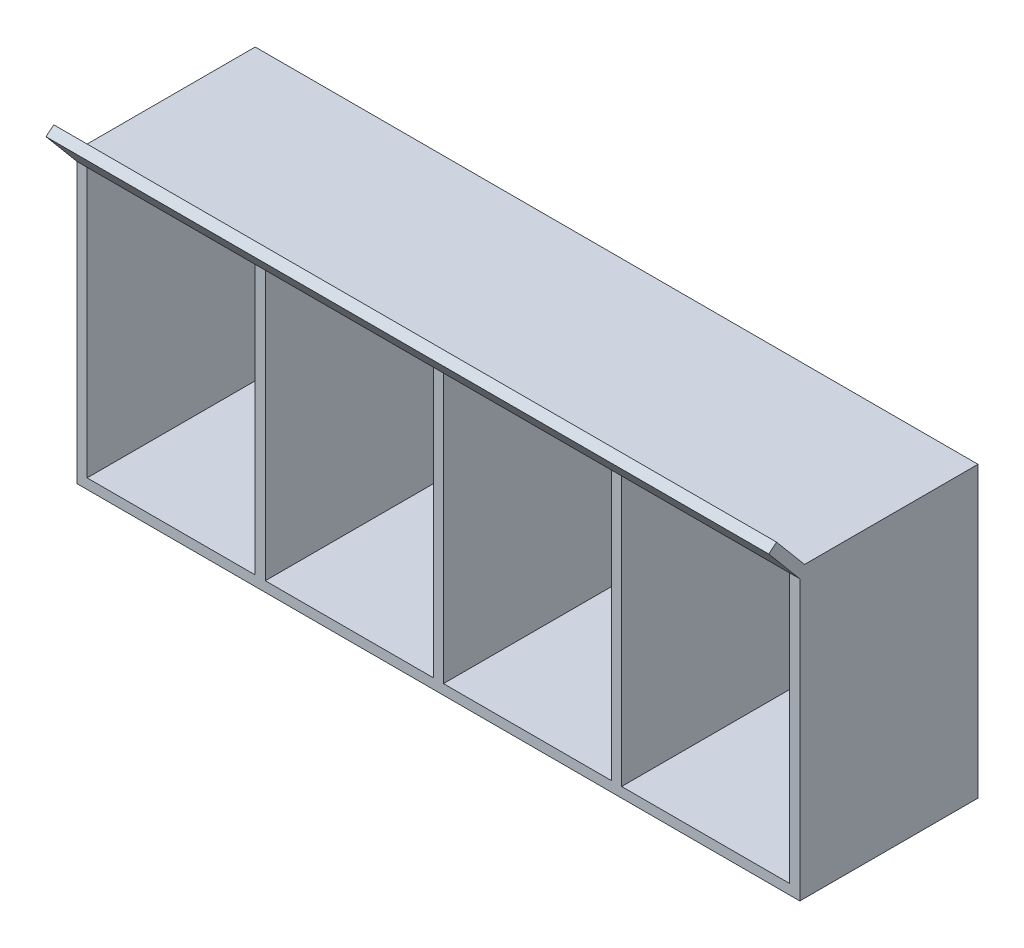
ISO-10303-21;
HEADER;
FILE_DESCRIPTION(('STEP AP214'),'2;1');
FILE_NAME('part.step','',(''),(''),'','','');
FILE_SCHEMA(('AUTOMOTIVE_DESIGN { 1 0 10303 214 1 1 1 1 }'));
ENDSEC;
DATA;
#1=APPLICATION_CONTEXT('core data for automotive mechanical design processes');
#2=APPLICATION_PROTOCOL_DEFINITION('international standard','automotive_design',2000,#1);
#3=PRODUCT_CONTEXT('',#1,'mechanical');
#4=PRODUCT('Part','Part','',(#3));
#5=PRODUCT_RELATED_PRODUCT_CATEGORY('part','',(#4));
#6=PRODUCT_DEFINITION_FORMATION('','',#4);
#7=PRODUCT_DEFINITION_CONTEXT('part definition',#1,'design');
#8=PRODUCT_DEFINITION('design','',#6,#7);
#9=PRODUCT_DEFINITION_SHAPE('','',#8);
#10=(LENGTH_UNIT() NAMED_UNIT(*) SI_UNIT(.MILLI.,.METRE.));
#11=(NAMED_UNIT(*) PLANE_ANGLE_UNIT() SI_UNIT($,.RADIAN.));
#12=(NAMED_UNIT(*) SI_UNIT($,.STERADIAN.) SOLID_ANGLE_UNIT());
#13=UNCERTAINTY_MEASURE_WITH_UNIT(LENGTH_MEASURE(1.E-05),#10,'distance_accuracy_value','');
#14=(GEOMETRIC_REPRESENTATION_CONTEXT(3) GLOBAL_UNCERTAINTY_ASSIGNED_CONTEXT((#13)) GLOBAL_UNIT_ASSIGNED_CONTEXT((#10,
#11,#12)) REPRESENTATION_CONTEXT('',''));
#15=CARTESIAN_POINT('',(0.,0.,0.));
#16=DIRECTION('',(0.,0.,1.));
#17=DIRECTION('',(1.,0.,0.));
#18=AXIS2_PLACEMENT_3D('',#15,#16,#17);
#19=CARTESIAN_POINT('',(3.,0.,50.));
#20=DIRECTION('',(1.,0.,0.));
#21=DIRECTION('',(0.,0.,-1.));
#22=AXIS2_PLACEMENT_3D('',#19,#20,#21);
#23=PLANE('',#22);
#24=DIRECTION('',(0.,-1.,0.));
#25=VECTOR('',#24,1.);
#26=CARTESIAN_POINT('',(3.,0.,0.));
#27=LINE('',#26,#25);
#28=CARTESIAN_POINT('',(3.,83.,0.));
#29=VERTEX_POINT('',#28);
#30=CARTESIAN_POINT('',(3.,3.,0.));
#31=VERTEX_POINT('',#30);
#32=EDGE_CURVE('E231',#29,#31,#27,.T.);
#33=ORIENTED_EDGE('',*,*,#32,.F.);
#34=DIRECTION('',(0.,0.,-1.));
#35=VECTOR('',#34,1.);
#36=CARTESIAN_POINT('',(3.,83.,50.));
#37=LINE('',#36,#35);
#38=CARTESIAN_POINT('',(3.,83.,50.));
#39=VERTEX_POINT('',#38);
#40=EDGE_CURVE('E247',#39,#29,#37,.T.);
#41=ORIENTED_EDGE('',*,*,#40,.F.);
#42=DIRECTION('',(0.,-1.,0.));
#43=VECTOR('',#42,1.);
#44=CARTESIAN_POINT('',(3.,0.,50.));
#45=LINE('',#44,#43);
#46=CARTESIAN_POINT('',(3.,3.,50.));
#47=VERTEX_POINT('',#46);
#48=EDGE_CURVE('E162',#39,#47,#45,.T.);
#49=ORIENTED_EDGE('',*,*,#48,.T.);
#50=DIRECTION('',(0.,0.,-1.));
#51=VECTOR('',#50,1.);
#52=CARTESIAN_POINT('',(3.,3.,50.));
#53=LINE('',#52,#51);
#54=EDGE_CURVE('E74',#47,#31,#53,.T.);
#55=ORIENTED_EDGE('',*,*,#54,.T.);
#56=EDGE_LOOP('',(#33,#41,#49,#55));
#57=FACE_BOUND('',#56,.T.);
#58=ADVANCED_FACE('F49',(#57),#23,.T.);
#59=CARTESIAN_POINT('',(0.,83.,50.));
#60=DIRECTION('',(0.,1.,0.));
#61=DIRECTION('',(0.,0.,1.));
#62=AXIS2_PLACEMENT_3D('',#59,#60,#61);
#63=PLANE('',#62);
#64=DIRECTION('',(1.,0.,0.));
#65=VECTOR('',#64,1.);
#66=CARTESIAN_POINT('',(0.,83.,0.));
#67=LINE('',#66,#65);
#68=CARTESIAN_POINT('',(53.,83.,0.));
#69=VERTEX_POINT('',#68);
#70=EDGE_CURVE('E234',#29,#69,#67,.T.);
#71=ORIENTED_EDGE('',*,*,#70,.T.);
#72=DIRECTION('',(0.,0.,-1.));
#73=VECTOR('',#72,1.);
#74=CARTESIAN_POINT('',(53.,83.,50.));
#75=LINE('',#74,#73);
#76=CARTESIAN_POINT('',(53.,83.,50.));
#77=VERTEX_POINT('',#76);
#78=EDGE_CURVE('E245',#77,#69,#75,.T.);
#79=ORIENTED_EDGE('',*,*,#78,.F.);
#80=DIRECTION('',(1.,0.,0.));
#81=VECTOR('',#80,1.);
#82=CARTESIAN_POINT('',(0.,83.,50.));
#83=LINE('',#82,#81);
#84=EDGE_CURVE('E190',#39,#77,#83,.T.);
#85=ORIENTED_EDGE('',*,*,#84,.F.);
#86=ORIENTED_EDGE('',*,*,#40,.T.);
#87=EDGE_LOOP('',(#71,#79,#85,#86));
#88=FACE_BOUND('',#87,.T.);
#89=ADVANCED_FACE('F464',(#88),#63,.F.);
#90=CARTESIAN_POINT('',(53.,0.,50.));
#91=DIRECTION('',(1.,0.,0.));
#92=DIRECTION('',(0.,0.,-1.));
#93=AXIS2_PLACEMENT_3D('',#90,#91,#92);
#94=PLANE('',#93);
#95=DIRECTION('',(0.,-1.,0.));
#96=VECTOR('',#95,1.);
#97=CARTESIAN_POINT('',(53.,0.,0.));
#98=LINE('',#97,#96);
#99=CARTESIAN_POINT('',(53.,3.,0.));
#100=VERTEX_POINT('',#99);
#101=EDGE_CURVE('E115',#69,#100,#98,.T.);
#102=ORIENTED_EDGE('',*,*,#101,.T.);
#103=DIRECTION('',(0.,0.,-1.));
#104=VECTOR('',#103,1.);
#105=CARTESIAN_POINT('',(53.,3.,50.));
#106=LINE('',#105,#104);
#107=CARTESIAN_POINT('',(53.,3.,50.));
#108=VERTEX_POINT('',#107);
#109=EDGE_CURVE('E242',#108,#100,#106,.T.);
#110=ORIENTED_EDGE('',*,*,#109,.F.);
#111=DIRECTION('',(0.,-1.,0.));
#112=VECTOR('',#111,1.);
#113=CARTESIAN_POINT('',(53.,0.,50.));
#114=LINE('',#113,#112);
#115=EDGE_CURVE('E193',#77,#108,#114,.T.);
#116=ORIENTED_EDGE('',*,*,#115,.F.);
#117=ORIENTED_EDGE('',*,*,#78,.T.);
#118=EDGE_LOOP('',(#102,#110,#116,#117));
#119=FACE_BOUND('',#118,.T.);
#120=ADVANCED_FACE('F471',(#119),#94,.F.);
#121=CARTESIAN_POINT('',(0.,3.,50.));
#122=DIRECTION('',(0.,1.,0.));
#123=DIRECTION('',(0.,0.,1.));
#124=AXIS2_PLACEMENT_3D('',#121,#122,#123);
#125=PLANE('',#124);
#126=DIRECTION('',(1.,0.,0.));
#127=VECTOR('',#126,1.);
#128=CARTESIAN_POINT('',(0.,3.,0.));
#129=LINE('',#128,#127);
#130=CARTESIAN_POINT('',(56.,3.,0.));
#131=VERTEX_POINT('',#130);
#132=CARTESIAN_POINT('',(106.,3.,0.));
#133=VERTEX_POINT('',#132);
#134=EDGE_CURVE('E222',#131,#133,#129,.T.);
#135=ORIENTED_EDGE('',*,*,#134,.F.);
#136=DIRECTION('',(0.,0.,-1.));
#137=VECTOR('',#136,1.);
#138=CARTESIAN_POINT('',(56.,3.,50.));
#139=LINE('',#138,#137);
#140=CARTESIAN_POINT('',(56.,3.,50.));
#141=VERTEX_POINT('',#140);
#142=EDGE_CURVE('E178',#141,#131,#139,.T.);
#143=ORIENTED_EDGE('',*,*,#142,.F.);
#144=DIRECTION('',(1.,0.,0.));
#145=VECTOR('',#144,1.);
#146=CARTESIAN_POINT('',(0.,3.,50.));
#147=LINE('',#146,#145);
#148=CARTESIAN_POINT('',(106.,3.,50.));
#149=VERTEX_POINT('',#148);
#150=EDGE_CURVE('E155',#141,#149,#147,.T.);
#151=ORIENTED_EDGE('',*,*,#150,.T.);
#152=DIRECTION('',(0.,0.,-1.));
#153=VECTOR('',#152,1.);
#154=CARTESIAN_POINT('',(106.,3.,50.));
#155=LINE('',#154,#153);
#156=EDGE_CURVE('E166',#149,#133,#155,.T.);
#157=ORIENTED_EDGE('',*,*,#156,.T.);
#158=EDGE_LOOP('',(#135,#143,#151,#157));
#159=FACE_BOUND('',#158,.T.);
#160=ADVANCED_FACE('F176',(#159),#125,.T.);
#161=CARTESIAN_POINT('',(56.,0.,50.));
#162=DIRECTION('',(1.,0.,0.));
#163=DIRECTION('',(0.,0.,-1.));
#164=AXIS2_PLACEMENT_3D('',#161,#162,#163);
#165=PLANE('',#164);
#166=DIRECTION('',(0.,-1.,0.));
#167=VECTOR('',#166,1.);
#168=CARTESIAN_POINT('',(56.,0.,0.));
#169=LINE('',#168,#167);
#170=CARTESIAN_POINT('',(56.,83.,0.));
#171=VERTEX_POINT('',#170);
#172=EDGE_CURVE('E224',#171,#131,#169,.T.);
#173=ORIENTED_EDGE('',*,*,#172,.F.);
#174=DIRECTION('',(0.,0.,-1.));
#175=VECTOR('',#174,1.);
#176=CARTESIAN_POINT('',(56.,83.,50.));
#177=LINE('',#176,#175);
#178=CARTESIAN_POINT('',(56.,83.,50.));
#179=VERTEX_POINT('',#178);
#180=EDGE_CURVE('E251',#179,#171,#177,.T.);
#181=ORIENTED_EDGE('',*,*,#180,.F.);
#182=DIRECTION('',(0.,-1.,0.));
#183=VECTOR('',#182,1.);
#184=CARTESIAN_POINT('',(56.,0.,50.));
#185=LINE('',#184,#183);
#186=EDGE_CURVE('E179',#179,#141,#185,.T.);
#187=ORIENTED_EDGE('',*,*,#186,.T.);
#188=ORIENTED_EDGE('',*,*,#142,.T.);
#189=EDGE_LOOP('',(#173,#181,#187,#188));
#190=FACE_BOUND('',#189,.T.);
#191=ADVANCED_FACE('F375',(#190),#165,.T.);
#192=CARTESIAN_POINT('',(0.,83.,50.));
#193=DIRECTION('',(0.,1.,0.));
#194=DIRECTION('',(0.,0.,1.));
#195=AXIS2_PLACEMENT_3D('',#192,#193,#194);
#196=PLANE('',#195);
#197=DIRECTION('',(1.,0.,0.));
#198=VECTOR('',#197,1.);
#199=CARTESIAN_POINT('',(0.,83.,0.));
#200=LINE('',#199,#198);
#201=CARTESIAN_POINT('',(106.,83.,0.));
#202=VERTEX_POINT('',#201);
#203=EDGE_CURVE('E227',#171,#202,#200,.T.);
#204=ORIENTED_EDGE('',*,*,#203,.T.);
#205=DIRECTION('',(0.,0.,-1.));
#206=VECTOR('',#205,1.);
#207=CARTESIAN_POINT('',(106.,83.,50.));
#208=LINE('',#207,#206);
#209=CARTESIAN_POINT('',(106.,83.,50.));
#210=VERTEX_POINT('',#209);
#211=EDGE_CURVE('E173',#210,#202,#208,.T.);
#212=ORIENTED_EDGE('',*,*,#211,.F.);
#213=DIRECTION('',(1.,0.,0.));
#214=VECTOR('',#213,1.);
#215=CARTESIAN_POINT('',(0.,83.,50.));
#216=LINE('',#215,#214);
#217=EDGE_CURVE('E163',#179,#210,#216,.T.);
#218=ORIENTED_EDGE('',*,*,#217,.F.);
#219=ORIENTED_EDGE('',*,*,#180,.T.);
#220=EDGE_LOOP('',(#204,#212,#218,#219));
#221=FACE_BOUND('',#220,.T.);
#222=ADVANCED_FACE('F380',(#221),#196,.F.);
#223=CARTESIAN_POINT('',(0.,3.,50.));
#224=DIRECTION('',(0.,1.,0.));
#225=DIRECTION('',(-1.,0.,0.));
#226=AXIS2_PLACEMENT_3D('',#223,#224,#225);
#227=PLANE('',#226);
#228=DIRECTION('',(1.,0.,0.));
#229=VECTOR('',#228,1.);
#230=CARTESIAN_POINT('',(0.,3.,0.));
#231=LINE('',#230,#229);
#232=CARTESIAN_POINT('',(109.,3.,0.));
#233=VERTEX_POINT('',#232);
#234=CARTESIAN_POINT('',(159.,2.99999999999999,0.));
#235=VERTEX_POINT('',#234);
#236=EDGE_CURVE('E210',#233,#235,#231,.T.);
#237=ORIENTED_EDGE('',*,*,#236,.F.);
#238=DIRECTION('',(0.,0.,-1.));
#239=VECTOR('',#238,1.);
#240=CARTESIAN_POINT('',(109.,3.,50.));
#241=LINE('',#240,#239);
#242=CARTESIAN_POINT('',(109.,3.,50.));
#243=VERTEX_POINT('',#242);
#244=EDGE_CURVE('E174',#243,#233,#241,.T.);
#245=ORIENTED_EDGE('',*,*,#244,.F.);
#246=DIRECTION('',(1.,0.,0.));
#247=VECTOR('',#246,1.);
#248=CARTESIAN_POINT('',(0.,3.,50.));
#249=LINE('',#248,#247);
#250=CARTESIAN_POINT('',(159.,2.99999999999999,50.));
#251=VERTEX_POINT('',#250);
#252=EDGE_CURVE('E318',#243,#251,#249,.T.);
#253=ORIENTED_EDGE('',*,*,#252,.T.);
#254=DIRECTION('',(0.,0.,-1.));
#255=VECTOR('',#254,1.);
#256=CARTESIAN_POINT('',(159.,2.99999999999999,50.));
#257=LINE('',#256,#255);
#258=EDGE_CURVE('E254',#251,#235,#257,.T.);
#259=ORIENTED_EDGE('',*,*,#258,.T.);
#260=EDGE_LOOP('',(#237,#245,#253,#259));
#261=FACE_BOUND('',#260,.T.);
#262=ADVANCED_FACE('F349',(#261),#227,.T.);
#263=CARTESIAN_POINT('',(109.,0.,50.));
#264=DIRECTION('',(1.,0.,0.));
#265=DIRECTION('',(0.,0.,-1.));
#266=AXIS2_PLACEMENT_3D('',#263,#264,#265);
#267=PLANE('',#266);
#268=DIRECTION('',(0.,-1.,0.));
#269=VECTOR('',#268,1.);
#270=CARTESIAN_POINT('',(109.,0.,0.));
#271=LINE('',#270,#269);
#272=CARTESIAN_POINT('',(109.,83.,0.));
#273=VERTEX_POINT('',#272);
#274=EDGE_CURVE('E213',#273,#233,#271,.T.);
#275=ORIENTED_EDGE('',*,*,#274,.F.);
#276=DIRECTION('',(0.,0.,-1.));
#277=VECTOR('',#276,1.);
#278=CARTESIAN_POINT('',(109.,83.,50.));
#279=LINE('',#278,#277);
#280=CARTESIAN_POINT('',(109.,83.,50.));
#281=VERTEX_POINT('',#280);
#282=EDGE_CURVE('E259',#281,#273,#279,.T.);
#283=ORIENTED_EDGE('',*,*,#282,.F.);
#284=DIRECTION('',(0.,-1.,0.));
#285=VECTOR('',#284,1.);
#286=CARTESIAN_POINT('',(109.,0.,50.));
#287=LINE('',#286,#285);
#288=EDGE_CURVE('E321',#281,#243,#287,.T.);
#289=ORIENTED_EDGE('',*,*,#288,.T.);
#290=ORIENTED_EDGE('',*,*,#244,.T.);
#291=EDGE_LOOP('',(#275,#283,#289,#290));
#292=FACE_BOUND('',#291,.T.);
#293=ADVANCED_FACE('F352',(#292),#267,.T.);
#294=CARTESIAN_POINT('',(0.,83.,50.));
#295=DIRECTION('',(0.,1.,0.));
#296=DIRECTION('',(0.,0.,1.));
#297=AXIS2_PLACEMENT_3D('',#294,#295,#296);
#298=PLANE('',#297);
#299=DIRECTION('',(1.,0.,0.));
#300=VECTOR('',#299,1.);
#301=CARTESIAN_POINT('',(0.,83.,0.));
#302=LINE('',#301,#300);
#303=CARTESIAN_POINT('',(159.,83.,0.));
#304=VERTEX_POINT('',#303);
#305=EDGE_CURVE('E216',#273,#304,#302,.T.);
#306=ORIENTED_EDGE('',*,*,#305,.T.);
#307=DIRECTION('',(0.,0.,-1.));
#308=VECTOR('',#307,1.);
#309=CARTESIAN_POINT('',(159.,83.,50.));
#310=LINE('',#309,#308);
#311=CARTESIAN_POINT('',(159.,83.,50.));
#312=VERTEX_POINT('',#311);
#313=EDGE_CURVE('E256',#312,#304,#310,.T.);
#314=ORIENTED_EDGE('',*,*,#313,.F.);
#315=DIRECTION('',(1.,0.,0.));
#316=VECTOR('',#315,1.);
#317=CARTESIAN_POINT('',(0.,83.,50.));
#318=LINE('',#317,#316);
#319=EDGE_CURVE('E183',#281,#312,#318,.T.);
#320=ORIENTED_EDGE('',*,*,#319,.F.);
#321=ORIENTED_EDGE('',*,*,#282,.T.);
#322=EDGE_LOOP('',(#306,#314,#320,#321));
#323=FACE_BOUND('',#322,.T.);
#324=ADVANCED_FACE('F341',(#323),#298,.F.);
#325=CARTESIAN_POINT('',(215.,0.,50.));
#326=DIRECTION('',(1.,0.,0.));
#327=DIRECTION('',(0.,0.,-1.));
#328=AXIS2_PLACEMENT_3D('',#325,#326,#327);
#329=PLANE('',#328);
#330=DIRECTION('',(0.,0.,-1.));
#331=VECTOR('',#330,1.);
#332=CARTESIAN_POINT('',(215.,86.,50.));
#333=LINE('',#332,#331);
#334=CARTESIAN_POINT('',(215.,86.,48.601077025535));
#335=VERTEX_POINT('',#334);
#336=CARTESIAN_POINT('',(215.,86.,-3.));
#337=VERTEX_POINT('',#336);
#338=EDGE_CURVE('E257',#335,#337,#333,.T.);
#339=ORIENTED_EDGE('',*,*,#338,.F.);
#340=DIRECTION('',(0.,0.766044443118979,0.642787609686538));
#341=VECTOR('',#340,1.);
#342=CARTESIAN_POINT('',(215.,95.9283628290596,56.9319626135931));
#343=LINE('',#342,#341);
#344=CARTESIAN_POINT('',(215.,95.9283628290596,56.9319626135931));
#345=VERTEX_POINT('',#344);
#346=EDGE_CURVE('E417',#335,#345,#343,.T.);
#347=ORIENTED_EDGE('',*,*,#346,.T.);
#348=DIRECTION('',(0.,-0.642787609686539,0.766044443118979));
#349=VECTOR('',#348,1.);
#350=CARTESIAN_POINT('',(215.,94.,59.2300959429501));
#351=LINE('',#350,#349);
#352=CARTESIAN_POINT('',(215.,94.,59.2300959429501));
#353=VERTEX_POINT('',#352);
#354=EDGE_CURVE('E909',#345,#353,#351,.T.);
#355=ORIENTED_EDGE('',*,*,#354,.T.);
#356=DIRECTION('',(0.,-0.766044443118979,-0.642787609686539));
#357=VECTOR('',#356,1.);
#358=CARTESIAN_POINT('',(215.,83.,50.));
#359=LINE('',#358,#357);
#360=CARTESIAN_POINT('',(215.,83.,50.));
#361=VERTEX_POINT('',#360);
#362=EDGE_CURVE('E65',#353,#361,#359,.T.);
#363=ORIENTED_EDGE('',*,*,#362,.T.);
#364=DIRECTION('',(0.,-1.,0.));
#365=VECTOR('',#364,1.);
#366=CARTESIAN_POINT('',(215.,0.,50.));
#367=LINE('',#366,#365);
#368=CARTESIAN_POINT('',(215.,0.,50.));
#369=VERTEX_POINT('',#368);
#370=EDGE_CURVE('E306',#361,#369,#367,.T.);
#371=ORIENTED_EDGE('',*,*,#370,.T.);
#372=DIRECTION('',(0.,0.,-1.));
#373=VECTOR('',#372,1.);
#374=CARTESIAN_POINT('',(215.,0.,50.));
#375=LINE('',#374,#373);
#376=CARTESIAN_POINT('',(215.,0.,-3.));
#377=VERTEX_POINT('',#376);
#378=EDGE_CURVE('E263',#369,#377,#375,.T.);
#379=ORIENTED_EDGE('',*,*,#378,.T.);
#380=DIRECTION('',(0.,-1.,0.));
#381=VECTOR('',#380,1.);
#382=CARTESIAN_POINT('',(215.,86.,-3.));
#383=LINE('',#382,#381);
#384=EDGE_CURVE('E440',#337,#377,#383,.T.);
#385=ORIENTED_EDGE('',*,*,#384,.F.);
#386=EDGE_LOOP('',(#339,#347,#355,#363,#371,#379,#385));
#387=FACE_BOUND('',#386,.T.);
#388=ADVANCED_FACE('F490',(#387),#329,.T.);
#389=CARTESIAN_POINT('',(0.,86.,50.));
#390=DIRECTION('',(0.,1.,0.));
#391=DIRECTION('',(-1.,0.,0.));
#392=AXIS2_PLACEMENT_3D('',#389,#390,#391);
#393=PLANE('',#392);
#394=DIRECTION('',(1.,0.,0.));
#395=VECTOR('',#394,1.);
#396=CARTESIAN_POINT('',(0.,86.,48.601077025535));
#397=LINE('',#396,#395);
#398=CARTESIAN_POINT('',(0.,86.,48.601077025535));
#399=VERTEX_POINT('',#398);
#400=EDGE_CURVE('E412',#399,#335,#397,.T.);
#401=ORIENTED_EDGE('',*,*,#400,.T.);
#402=ORIENTED_EDGE('',*,*,#338,.T.);
#403=DIRECTION('',(1.,0.,0.));
#404=VECTOR('',#403,1.);
#405=CARTESIAN_POINT('',(0.,86.,-3.));
#406=LINE('',#405,#404);
#407=CARTESIAN_POINT('',(0.,86.,-3.));
#408=VERTEX_POINT('',#407);
#409=EDGE_CURVE('E435',#408,#337,#406,.T.);
#410=ORIENTED_EDGE('',*,*,#409,.F.);
#411=DIRECTION('',(0.,0.,-1.));
#412=VECTOR('',#411,1.);
#413=CARTESIAN_POINT('',(0.,86.,50.));
#414=LINE('',#413,#412);
#415=EDGE_CURVE('E269',#399,#408,#414,.T.);
#416=ORIENTED_EDGE('',*,*,#415,.F.);
#417=EDGE_LOOP('',(#401,#402,#410,#416));
#418=FACE_BOUND('',#417,.T.);
#419=ADVANCED_FACE('F433',(#418),#393,.T.);
#420=CARTESIAN_POINT('',(0.,0.,50.));
#421=DIRECTION('',(1.,0.,0.));
#422=DIRECTION('',(0.,0.,-1.));
#423=AXIS2_PLACEMENT_3D('',#420,#421,#422);
#424=PLANE('',#423);
#425=DIRECTION('',(0.,0.766044443118979,0.642787609686538));
#426=VECTOR('',#425,1.);
#427=CARTESIAN_POINT('',(0.,95.9283628290596,56.9319626135931));
#428=LINE('',#427,#426);
#429=CARTESIAN_POINT('',(0.,95.9283628290596,56.9319626135931));
#430=VERTEX_POINT('',#429);
#431=EDGE_CURVE('E415',#399,#430,#428,.T.);
#432=ORIENTED_EDGE('',*,*,#431,.F.);
#433=ORIENTED_EDGE('',*,*,#415,.T.);
#434=DIRECTION('',(0.,1.,0.));
#435=VECTOR('',#434,1.);
#436=CARTESIAN_POINT('',(0.,86.,-3.));
#437=LINE('',#436,#435);
#438=CARTESIAN_POINT('',(0.,0.,-3.));
#439=VERTEX_POINT('',#438);
#440=EDGE_CURVE('E441',#439,#408,#437,.T.);
#441=ORIENTED_EDGE('',*,*,#440,.F.);
#442=DIRECTION('',(0.,0.,-1.));
#443=VECTOR('',#442,1.);
#444=CARTESIAN_POINT('',(0.,0.,50.));
#445=LINE('',#444,#443);
#446=CARTESIAN_POINT('',(0.,0.,50.));
#447=VERTEX_POINT('',#446);
#448=EDGE_CURVE('E266',#447,#439,#445,.T.);
#449=ORIENTED_EDGE('',*,*,#448,.F.);
#450=DIRECTION('',(0.,-1.,0.));
#451=VECTOR('',#450,1.);
#452=CARTESIAN_POINT('',(0.,0.,50.));
#453=LINE('',#452,#451);
#454=CARTESIAN_POINT('',(0.,83.,50.));
#455=VERTEX_POINT('',#454);
#456=EDGE_CURVE('E309',#455,#447,#453,.T.);
#457=ORIENTED_EDGE('',*,*,#456,.F.);
#458=DIRECTION('',(0.,-0.766044443118979,-0.642787609686539));
#459=VECTOR('',#458,1.);
#460=CARTESIAN_POINT('',(0.,83.,50.));
#461=LINE('',#460,#459);
#462=CARTESIAN_POINT('',(0.,94.,59.2300959429501));
#463=VERTEX_POINT('',#462);
#464=EDGE_CURVE('E422',#463,#455,#461,.T.);
#465=ORIENTED_EDGE('',*,*,#464,.F.);
#466=DIRECTION('',(0.,-0.642787609686539,0.766044443118979));
#467=VECTOR('',#466,1.);
#468=CARTESIAN_POINT('',(0.,94.,59.2300959429501));
#469=LINE('',#468,#467);
#470=EDGE_CURVE('E431',#430,#463,#469,.T.);
#471=ORIENTED_EDGE('',*,*,#470,.F.);
#472=EDGE_LOOP('',(#432,#433,#441,#449,#457,#465,#471));
#473=FACE_BOUND('',#472,.T.);
#474=ADVANCED_FACE('F426',(#473),#424,.F.);
#475=CARTESIAN_POINT('',(0.,3.,50.));
#476=DIRECTION('',(0.,1.,0.));
#477=DIRECTION('',(-1.,0.,0.));
#478=AXIS2_PLACEMENT_3D('',#475,#476,#477);
#479=PLANE('',#478);
#480=DIRECTION('',(1.,0.,0.));
#481=VECTOR('',#480,1.);
#482=CARTESIAN_POINT('',(0.,3.,0.));
#483=LINE('',#482,#481);
#484=CARTESIAN_POINT('',(162.,2.99999999999999,0.));
#485=VERTEX_POINT('',#484);
#486=CARTESIAN_POINT('',(212.,2.99999999999999,0.));
#487=VERTEX_POINT('',#486);
#488=EDGE_CURVE('E198',#485,#487,#483,.T.);
#489=ORIENTED_EDGE('',*,*,#488,.F.);
#490=DIRECTION('',(0.,0.,-1.));
#491=VECTOR('',#490,1.);
#492=CARTESIAN_POINT('',(162.,2.99999999999999,50.));
#493=LINE('',#492,#491);
#494=CARTESIAN_POINT('',(162.,2.99999999999999,50.));
#495=VERTEX_POINT('',#494);
#496=EDGE_CURVE('E124',#495,#485,#493,.T.);
#497=ORIENTED_EDGE('',*,*,#496,.F.);
#498=DIRECTION('',(1.,0.,0.));
#499=VECTOR('',#498,1.);
#500=CARTESIAN_POINT('',(0.,3.,50.));
#501=LINE('',#500,#499);
#502=CARTESIAN_POINT('',(212.,2.99999999999999,50.));
#503=VERTEX_POINT('',#502);
#504=EDGE_CURVE('E240',#495,#503,#501,.T.);
#505=ORIENTED_EDGE('',*,*,#504,.T.);
#506=DIRECTION('',(0.,0.,-1.));
#507=VECTOR('',#506,1.);
#508=CARTESIAN_POINT('',(212.,2.99999999999999,50.));
#509=LINE('',#508,#507);
#510=EDGE_CURVE('E197',#503,#487,#509,.T.);
#511=ORIENTED_EDGE('',*,*,#510,.T.);
#512=EDGE_LOOP('',(#489,#497,#505,#511));
#513=FACE_BOUND('',#512,.T.);
#514=ADVANCED_FACE('F51',(#513),#479,.T.);
#515=CARTESIAN_POINT('',(162.,0.,50.));
#516=DIRECTION('',(1.,0.,0.));
#517=DIRECTION('',(0.,0.,-1.));
#518=AXIS2_PLACEMENT_3D('',#515,#516,#517);
#519=PLANE('',#518);
#520=DIRECTION('',(0.,-1.,0.));
#521=VECTOR('',#520,1.);
#522=CARTESIAN_POINT('',(162.,0.,0.));
#523=LINE('',#522,#521);
#524=CARTESIAN_POINT('',(162.,83.,0.));
#525=VERTEX_POINT('',#524);
#526=EDGE_CURVE('E201',#525,#485,#523,.T.);
#527=ORIENTED_EDGE('',*,*,#526,.F.);
#528=DIRECTION('',(0.,0.,-1.));
#529=VECTOR('',#528,1.);
#530=CARTESIAN_POINT('',(162.,83.,50.));
#531=LINE('',#530,#529);
#532=CARTESIAN_POINT('',(162.,83.,50.));
#533=VERTEX_POINT('',#532);
#534=EDGE_CURVE('E278',#533,#525,#531,.T.);
#535=ORIENTED_EDGE('',*,*,#534,.F.);
#536=DIRECTION('',(0.,-1.,0.));
#537=VECTOR('',#536,1.);
#538=CARTESIAN_POINT('',(162.,0.,50.));
#539=LINE('',#538,#537);
#540=EDGE_CURVE('E286',#533,#495,#539,.T.);
#541=ORIENTED_EDGE('',*,*,#540,.T.);
#542=ORIENTED_EDGE('',*,*,#496,.T.);
#543=EDGE_LOOP('',(#527,#535,#541,#542));
#544=FACE_BOUND('',#543,.T.);
#545=ADVANCED_FACE('F282',(#544),#519,.T.);
#546=CARTESIAN_POINT('',(0.,83.,50.));
#547=DIRECTION('',(0.,1.,0.));
#548=DIRECTION('',(0.,0.,1.));
#549=AXIS2_PLACEMENT_3D('',#546,#547,#548);
#550=PLANE('',#549);
#551=DIRECTION('',(1.,0.,0.));
#552=VECTOR('',#551,1.);
#553=CARTESIAN_POINT('',(0.,83.,0.));
#554=LINE('',#553,#552);
#555=CARTESIAN_POINT('',(212.,83.,0.));
#556=VERTEX_POINT('',#555);
#557=EDGE_CURVE('E205',#525,#556,#554,.T.);
#558=ORIENTED_EDGE('',*,*,#557,.T.);
#559=DIRECTION('',(0.,0.,-1.));
#560=VECTOR('',#559,1.);
#561=CARTESIAN_POINT('',(212.,83.,50.));
#562=LINE('',#561,#560);
#563=CARTESIAN_POINT('',(212.,83.,50.));
#564=VERTEX_POINT('',#563);
#565=EDGE_CURVE('E275',#564,#556,#562,.T.);
#566=ORIENTED_EDGE('',*,*,#565,.F.);
#567=DIRECTION('',(1.,0.,0.));
#568=VECTOR('',#567,1.);
#569=CARTESIAN_POINT('',(0.,83.,50.));
#570=LINE('',#569,#568);
#571=EDGE_CURVE('E307',#533,#564,#570,.T.);
#572=ORIENTED_EDGE('',*,*,#571,.F.);
#573=ORIENTED_EDGE('',*,*,#534,.T.);
#574=EDGE_LOOP('',(#558,#566,#572,#573));
#575=FACE_BOUND('',#574,.T.);
#576=ADVANCED_FACE('F293',(#575),#550,.F.);
#577=CARTESIAN_POINT('',(106.,0.,50.));
#578=DIRECTION('',(1.,0.,0.));
#579=DIRECTION('',(0.,0.,-1.));
#580=AXIS2_PLACEMENT_3D('',#577,#578,#579);
#581=PLANE('',#580);
#582=DIRECTION('',(0.,-1.,0.));
#583=VECTOR('',#582,1.);
#584=CARTESIAN_POINT('',(106.,0.,0.));
#585=LINE('',#584,#583);
#586=EDGE_CURVE('E169',#202,#133,#585,.T.);
#587=ORIENTED_EDGE('',*,*,#586,.T.);
#588=ORIENTED_EDGE('',*,*,#156,.F.);
#589=DIRECTION('',(0.,-1.,0.));
#590=VECTOR('',#589,1.);
#591=CARTESIAN_POINT('',(106.,0.,50.));
#592=LINE('',#591,#590);
#593=EDGE_CURVE('E149',#210,#149,#592,.T.);
#594=ORIENTED_EDGE('',*,*,#593,.F.);
#595=ORIENTED_EDGE('',*,*,#211,.T.);
#596=EDGE_LOOP('',(#587,#588,#594,#595));
#597=FACE_BOUND('',#596,.T.);
#598=ADVANCED_FACE('F167',(#597),#581,.F.);
#599=CARTESIAN_POINT('',(159.,0.,50.));
#600=DIRECTION('',(1.,0.,0.));
#601=DIRECTION('',(0.,0.,-1.));
#602=AXIS2_PLACEMENT_3D('',#599,#600,#601);
#603=PLANE('',#602);
#604=DIRECTION('',(0.,-1.,0.));
#605=VECTOR('',#604,1.);
#606=CARTESIAN_POINT('',(159.,0.,0.));
#607=LINE('',#606,#605);
#608=EDGE_CURVE('E219',#304,#235,#607,.T.);
#609=ORIENTED_EDGE('',*,*,#608,.T.);
#610=ORIENTED_EDGE('',*,*,#258,.F.);
#611=DIRECTION('',(0.,-1.,0.));
#612=VECTOR('',#611,1.);
#613=CARTESIAN_POINT('',(159.,0.,50.));
#614=LINE('',#613,#612);
#615=EDGE_CURVE('E180',#312,#251,#614,.T.);
#616=ORIENTED_EDGE('',*,*,#615,.F.);
#617=ORIENTED_EDGE('',*,*,#313,.T.);
#618=EDGE_LOOP('',(#609,#610,#616,#617));
#619=FACE_BOUND('',#618,.T.);
#620=ADVANCED_FACE('F340',(#619),#603,.F.);
#621=CARTESIAN_POINT('',(0.,0.,50.));
#622=DIRECTION('',(0.,1.,0.));
#623=DIRECTION('',(-1.,0.,0.));
#624=AXIS2_PLACEMENT_3D('',#621,#622,#623);
#625=PLANE('',#624);
#626=ORIENTED_EDGE('',*,*,#448,.T.);
#627=DIRECTION('',(-1.,0.,0.));
#628=VECTOR('',#627,1.);
#629=CARTESIAN_POINT('',(0.,0.,-3.));
#630=LINE('',#629,#628);
#631=EDGE_CURVE('E202',#377,#439,#630,.T.);
#632=ORIENTED_EDGE('',*,*,#631,.F.);
#633=ORIENTED_EDGE('',*,*,#378,.F.);
#634=DIRECTION('',(1.,0.,0.));
#635=VECTOR('',#634,1.);
#636=CARTESIAN_POINT('',(0.,0.,50.));
#637=LINE('',#636,#635);
#638=EDGE_CURVE('E315',#447,#369,#637,.T.);
#639=ORIENTED_EDGE('',*,*,#638,.F.);
#640=EDGE_LOOP('',(#626,#632,#633,#639));
#641=FACE_BOUND('',#640,.T.);
#642=ADVANCED_FACE('F487',(#641),#625,.F.);
#643=CARTESIAN_POINT('',(212.,0.,50.));
#644=DIRECTION('',(1.,0.,0.));
#645=DIRECTION('',(0.,0.,-1.));
#646=AXIS2_PLACEMENT_3D('',#643,#644,#645);
#647=PLANE('',#646);
#648=DIRECTION('',(0.,-1.,0.));
#649=VECTOR('',#648,1.);
#650=CARTESIAN_POINT('',(212.,0.,0.));
#651=LINE('',#650,#649);
#652=EDGE_CURVE('E207',#556,#487,#651,.T.);
#653=ORIENTED_EDGE('',*,*,#652,.T.);
#654=ORIENTED_EDGE('',*,*,#510,.F.);
#655=DIRECTION('',(0.,-1.,0.));
#656=VECTOR('',#655,1.);
#657=CARTESIAN_POINT('',(212.,0.,50.));
#658=LINE('',#657,#656);
#659=EDGE_CURVE('E300',#564,#503,#658,.T.);
#660=ORIENTED_EDGE('',*,*,#659,.F.);
#661=ORIENTED_EDGE('',*,*,#565,.T.);
#662=EDGE_LOOP('',(#653,#654,#660,#661));
#663=FACE_BOUND('',#662,.T.);
#664=ADVANCED_FACE('F298',(#663),#647,.F.);
#665=CARTESIAN_POINT('',(0.,3.,50.));
#666=DIRECTION('',(0.,1.,0.));
#667=DIRECTION('',(-1.,0.,0.));
#668=AXIS2_PLACEMENT_3D('',#665,#666,#667);
#669=PLANE('',#668);
#670=DIRECTION('',(1.,0.,0.));
#671=VECTOR('',#670,1.);
#672=CARTESIAN_POINT('',(0.,3.,0.));
#673=LINE('',#672,#671);
#674=EDGE_CURVE('E238',#31,#100,#673,.T.);
#675=ORIENTED_EDGE('',*,*,#674,.F.);
#676=ORIENTED_EDGE('',*,*,#54,.F.);
#677=DIRECTION('',(1.,0.,0.));
#678=VECTOR('',#677,1.);
#679=CARTESIAN_POINT('',(0.,3.,50.));
#680=LINE('',#679,#678);
#681=EDGE_CURVE('E195',#47,#108,#680,.T.);
#682=ORIENTED_EDGE('',*,*,#681,.T.);
#683=ORIENTED_EDGE('',*,*,#109,.T.);
#684=EDGE_LOOP('',(#675,#676,#682,#683));
#685=FACE_BOUND('',#684,.T.);
#686=ADVANCED_FACE('F504',(#685),#669,.T.);
#687=CARTESIAN_POINT('',(0.,0.,50.));
#688=DIRECTION('',(0.,0.,1.));
#689=DIRECTION('',(1.,0.,0.));
#690=AXIS2_PLACEMENT_3D('',#687,#688,#689);
#691=PLANE('',#690);
#692=DIRECTION('',(1.,0.,0.));
#693=VECTOR('',#692,1.);
#694=CARTESIAN_POINT('',(0.,83.,50.));
#695=LINE('',#694,#693);
#696=EDGE_CURVE('E447',#455,#39,#695,.T.);
#697=ORIENTED_EDGE('',*,*,#696,.F.);
#698=ORIENTED_EDGE('',*,*,#456,.T.);
#699=ORIENTED_EDGE('',*,*,#638,.T.);
#700=ORIENTED_EDGE('',*,*,#370,.F.);
#701=DIRECTION('',(1.,0.,0.));
#702=VECTOR('',#701,1.);
#703=CARTESIAN_POINT('',(0.,83.,50.));
#704=LINE('',#703,#702);
#705=EDGE_CURVE('E53',#564,#361,#704,.T.);
#706=ORIENTED_EDGE('',*,*,#705,.F.);
#707=ORIENTED_EDGE('',*,*,#659,.T.);
#708=ORIENTED_EDGE('',*,*,#504,.F.);
#709=ORIENTED_EDGE('',*,*,#540,.F.);
#710=EDGE_CURVE('E330',#312,#533,#704,.T.);
#711=ORIENTED_EDGE('',*,*,#710,.F.);
#712=ORIENTED_EDGE('',*,*,#615,.T.);
#713=ORIENTED_EDGE('',*,*,#252,.F.);
#714=ORIENTED_EDGE('',*,*,#288,.F.);
#715=EDGE_CURVE('E58',#210,#281,#704,.T.);
#716=ORIENTED_EDGE('',*,*,#715,.F.);
#717=ORIENTED_EDGE('',*,*,#593,.T.);
#718=ORIENTED_EDGE('',*,*,#150,.F.);
#719=ORIENTED_EDGE('',*,*,#186,.F.);
#720=EDGE_CURVE('E11',#77,#179,#704,.T.);
#721=ORIENTED_EDGE('',*,*,#720,.F.);
#722=ORIENTED_EDGE('',*,*,#115,.T.);
#723=ORIENTED_EDGE('',*,*,#681,.F.);
#724=ORIENTED_EDGE('',*,*,#48,.F.);
#725=EDGE_LOOP('',(#697,#698,#699,#700,#706,#707,#708,#709,#711,#712,#713,#714,#716,#717,#718,
#719,#721,#722,#723,#724));
#726=FACE_BOUND('',#725,.T.);
#727=ADVANCED_FACE('F152',(#726),#691,.T.);
#728=CARTESIAN_POINT('',(0.,0.,0.));
#729=DIRECTION('',(0.,0.,1.));
#730=DIRECTION('',(1.,0.,0.));
#731=AXIS2_PLACEMENT_3D('',#728,#729,#730);
#732=PLANE('',#731);
#733=ORIENTED_EDGE('',*,*,#70,.F.);
#734=ORIENTED_EDGE('',*,*,#32,.T.);
#735=ORIENTED_EDGE('',*,*,#674,.T.);
#736=ORIENTED_EDGE('',*,*,#101,.F.);
#737=EDGE_LOOP('',(#733,#734,#735,#736));
#738=FACE_BOUND('',#737,.T.);
#739=ADVANCED_FACE('F529',(#738),#732,.T.);
#740=ORIENTED_EDGE('',*,*,#172,.T.);
#741=ORIENTED_EDGE('',*,*,#134,.T.);
#742=ORIENTED_EDGE('',*,*,#586,.F.);
#743=ORIENTED_EDGE('',*,*,#203,.F.);
#744=EDGE_LOOP('',(#740,#741,#742,#743));
#745=FACE_BOUND('',#744,.T.);
#746=ADVANCED_FACE('F378',(#745),#732,.T.);
#747=ORIENTED_EDGE('',*,*,#274,.T.);
#748=ORIENTED_EDGE('',*,*,#236,.T.);
#749=ORIENTED_EDGE('',*,*,#608,.F.);
#750=ORIENTED_EDGE('',*,*,#305,.F.);
#751=EDGE_LOOP('',(#747,#748,#749,#750));
#752=FACE_BOUND('',#751,.T.);
#753=ADVANCED_FACE('F346',(#752),#732,.T.);
#754=ORIENTED_EDGE('',*,*,#526,.T.);
#755=ORIENTED_EDGE('',*,*,#488,.T.);
#756=ORIENTED_EDGE('',*,*,#652,.F.);
#757=ORIENTED_EDGE('',*,*,#557,.F.);
#758=EDGE_LOOP('',(#754,#755,#756,#757));
#759=FACE_BOUND('',#758,.T.);
#760=ADVANCED_FACE('F289',(#759),#732,.T.);
#761=CARTESIAN_POINT('',(0.,0.,-3.));
#762=DIRECTION('',(0.,0.,1.));
#763=DIRECTION('',(1.,0.,0.));
#764=AXIS2_PLACEMENT_3D('',#761,#762,#763);
#765=PLANE('',#764);
#766=ORIENTED_EDGE('',*,*,#440,.T.);
#767=ORIENTED_EDGE('',*,*,#409,.T.);
#768=ORIENTED_EDGE('',*,*,#384,.T.);
#769=ORIENTED_EDGE('',*,*,#631,.T.);
#770=EDGE_LOOP('',(#766,#767,#768,#769));
#771=FACE_BOUND('',#770,.T.);
#772=ADVANCED_FACE('F444',(#771),#765,.F.);
#773=CARTESIAN_POINT('',(0.,83.,50.));
#774=DIRECTION('',(0.,-0.642787609686539,0.766044443118979));
#775=DIRECTION('',(0.,-0.766044443118979,-0.642787609686539));
#776=AXIS2_PLACEMENT_3D('',#773,#774,#775);
#777=PLANE('',#776);
#778=ORIENTED_EDGE('',*,*,#362,.F.);
#779=DIRECTION('',(1.,0.,0.));
#780=VECTOR('',#779,1.);
#781=CARTESIAN_POINT('',(0.,94.,59.2300959429501));
#782=LINE('',#781,#780);
#783=EDGE_CURVE('E449',#463,#353,#782,.T.);
#784=ORIENTED_EDGE('',*,*,#783,.F.);
#785=ORIENTED_EDGE('',*,*,#464,.T.);
#786=ORIENTED_EDGE('',*,*,#696,.T.);
#787=ORIENTED_EDGE('',*,*,#84,.T.);
#788=ORIENTED_EDGE('',*,*,#720,.T.);
#789=ORIENTED_EDGE('',*,*,#217,.T.);
#790=ORIENTED_EDGE('',*,*,#715,.T.);
#791=ORIENTED_EDGE('',*,*,#319,.T.);
#792=ORIENTED_EDGE('',*,*,#710,.T.);
#793=ORIENTED_EDGE('',*,*,#571,.T.);
#794=ORIENTED_EDGE('',*,*,#705,.T.);
#795=EDGE_LOOP('',(#778,#784,#785,#786,#787,#788,#789,#790,#791,#792,#793,#794));
#796=FACE_BOUND('',#795,.T.);
#797=ADVANCED_FACE('F329',(#796),#777,.T.);
#798=CARTESIAN_POINT('',(0.,94.,59.2300959429501));
#799=DIRECTION('',(0.,0.766044443118979,0.642787609686539));
#800=DIRECTION('',(0.,-0.642787609686539,0.766044443118979));
#801=AXIS2_PLACEMENT_3D('',#798,#799,#800);
#802=PLANE('',#801);
#803=ORIENTED_EDGE('',*,*,#354,.F.);
#804=DIRECTION('',(1.,0.,0.));
#805=VECTOR('',#804,1.);
#806=CARTESIAN_POINT('',(0.,95.9283628290596,56.9319626135931));
#807=LINE('',#806,#805);
#808=EDGE_CURVE('E421',#430,#345,#807,.T.);
#809=ORIENTED_EDGE('',*,*,#808,.F.);
#810=ORIENTED_EDGE('',*,*,#470,.T.);
#811=ORIENTED_EDGE('',*,*,#783,.T.);
#812=EDGE_LOOP('',(#803,#809,#810,#811));
#813=FACE_BOUND('',#812,.T.);
#814=ADVANCED_FACE('F539',(#813),#802,.T.);
#815=CARTESIAN_POINT('',(0.,95.9283628290596,56.9319626135931));
#816=DIRECTION('',(0.,0.642787609686538,-0.766044443118979));
#817=DIRECTION('',(0.,0.766044443118979,0.642787609686538));
#818=AXIS2_PLACEMENT_3D('',#815,#816,#817);
#819=PLANE('',#818);
#820=ORIENTED_EDGE('',*,*,#346,.F.);
#821=ORIENTED_EDGE('',*,*,#400,.F.);
#822=ORIENTED_EDGE('',*,*,#431,.T.);
#823=ORIENTED_EDGE('',*,*,#808,.T.);
#824=EDGE_LOOP('',(#820,#821,#822,#823));
#825=FACE_BOUND('',#824,.T.);
#826=ADVANCED_FACE('F414',(#825),#819,.T.);
#827=CLOSED_SHELL('',(#58,#89,#120,#160,#191,#222,#262,#293,#324,#388,#419,#474,#514,#545,#576,
#598,#620,#642,#664,#686,#727,#739,#746,#753,#760,#772,#797,#814,#826));
#828=MANIFOLD_SOLID_BREP('B2',#827);
#829=ADVANCED_BREP_SHAPE_REPRESENTATION('',(#18,#828),#14);
#830=SHAPE_DEFINITION_REPRESENTATION(#9,#829);
ENDSEC;
END-ISO-10303-21;
